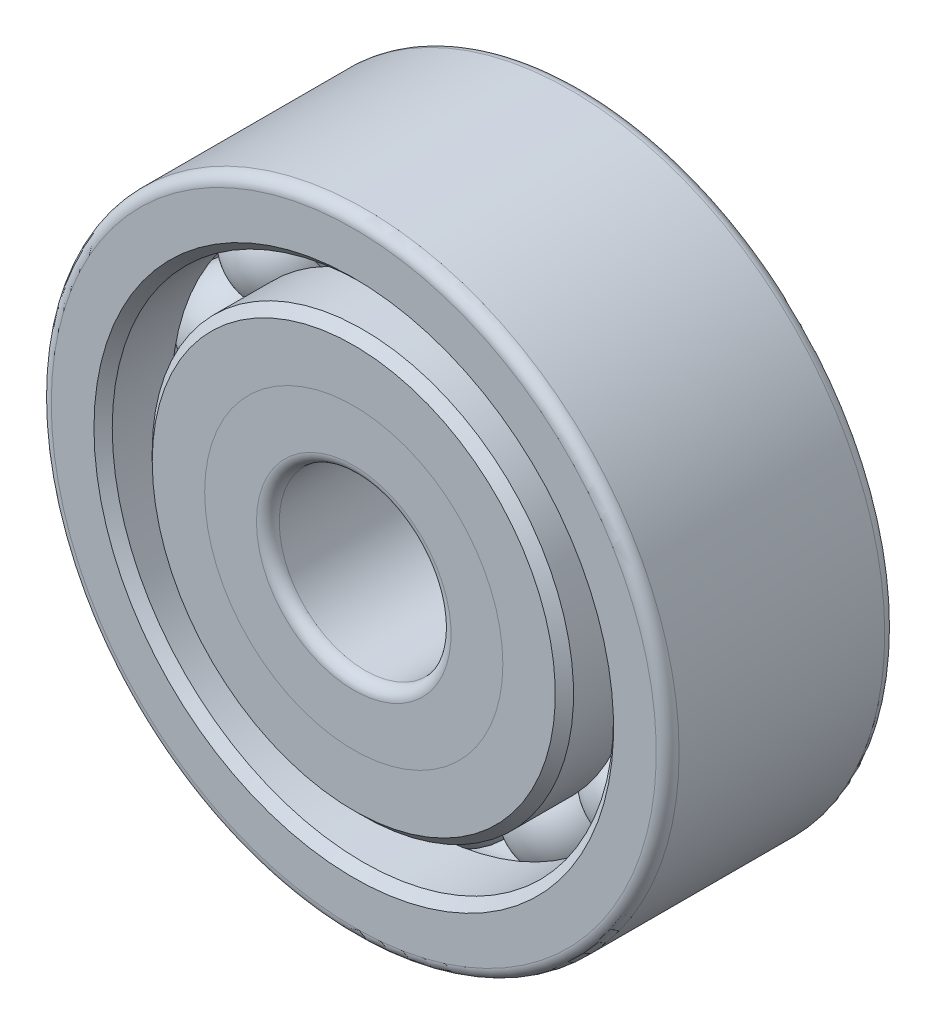
ISO-10303-21;
HEADER;
FILE_DESCRIPTION(('STEP AP214'),'2;1');
FILE_NAME('part.step','',(''),(''),'','','');
FILE_SCHEMA(('AUTOMOTIVE_DESIGN { 1 0 10303 214 1 1 1 1 }'));
ENDSEC;
DATA;
#1=APPLICATION_CONTEXT('core data for automotive mechanical design processes');
#2=APPLICATION_PROTOCOL_DEFINITION('international standard','automotive_design',2000,#1);
#3=PRODUCT_CONTEXT('',#1,'mechanical');
#4=PRODUCT('Part','Part','',(#3));
#5=PRODUCT_RELATED_PRODUCT_CATEGORY('part','',(#4));
#6=PRODUCT_DEFINITION_FORMATION('','',#4);
#7=PRODUCT_DEFINITION_CONTEXT('part definition',#1,'design');
#8=PRODUCT_DEFINITION('design','',#6,#7);
#9=PRODUCT_DEFINITION_SHAPE('','',#8);
#10=(LENGTH_UNIT() NAMED_UNIT(*) SI_UNIT(.MILLI.,.METRE.));
#11=(NAMED_UNIT(*) PLANE_ANGLE_UNIT() SI_UNIT($,.RADIAN.));
#12=(NAMED_UNIT(*) SI_UNIT($,.STERADIAN.) SOLID_ANGLE_UNIT());
#13=UNCERTAINTY_MEASURE_WITH_UNIT(LENGTH_MEASURE(1.E-05),#10,'distance_accuracy_value','');
#14=(GEOMETRIC_REPRESENTATION_CONTEXT(3) GLOBAL_UNCERTAINTY_ASSIGNED_CONTEXT((#13)) GLOBAL_UNIT_ASSIGNED_CONTEXT((#10,
#11,#12)) REPRESENTATION_CONTEXT('',''));
#15=CARTESIAN_POINT('',(0.,0.,0.));
#16=DIRECTION('',(0.,0.,1.));
#17=DIRECTION('',(1.,0.,0.));
#18=AXIS2_PLACEMENT_3D('',#15,#16,#17);
#19=CARTESIAN_POINT('',(0.,0.,-3.185));
#20=DIRECTION('',(0.,0.,1.));
#21=DIRECTION('',(1.,0.,0.));
#22=AXIS2_PLACEMENT_3D('',#19,#20,#21);
#23=CYLINDRICAL_SURFACE('',#22,4.14358666666667);
#24=CARTESIAN_POINT('',(0.,0.,-3.175));
#25=DIRECTION('',(0.,0.,1.));
#26=DIRECTION('',(1.,0.,0.));
#27=AXIS2_PLACEMENT_3D('',#24,#25,#26);
#28=CIRCLE('',#27,4.14358666666667);
#29=CARTESIAN_POINT('',(4.14358666666667,0.,-3.175));
#30=VERTEX_POINT('',#29);
#31=EDGE_CURVE('E60',#30,#30,#28,.T.);
#32=ORIENTED_EDGE('',*,*,#31,.T.);
#33=EDGE_LOOP('',(#32));
#34=FACE_BOUND('',#33,.T.);
#35=CARTESIAN_POINT('',(0.,0.,3.175));
#36=DIRECTION('',(0.,0.,-1.));
#37=DIRECTION('',(-1.,0.,0.));
#38=AXIS2_PLACEMENT_3D('',#35,#36,#37);
#39=CIRCLE('',#38,4.14358666666667);
#40=CARTESIAN_POINT('',(-4.14358666666667,0.,3.175));
#41=VERTEX_POINT('',#40);
#42=EDGE_CURVE('E48',#41,#41,#39,.T.);
#43=ORIENTED_EDGE('',*,*,#42,.T.);
#44=EDGE_LOOP('',(#43));
#45=FACE_BOUND('',#44,.T.);
#46=ADVANCED_FACE('F44',(#34,#45),#23,.T.);
#47=CARTESIAN_POINT('',(0.,2.3876,-3.175));
#48=DIRECTION('',(0.,0.,1.));
#49=DIRECTION('',(1.,0.,0.));
#50=AXIS2_PLACEMENT_3D('',#47,#48,#49);
#51=PLANE('',#50);
#52=CARTESIAN_POINT('',(0.,0.,-3.175));
#53=DIRECTION('',(0.,0.,1.));
#54=DIRECTION('',(1.,0.,0.));
#55=AXIS2_PLACEMENT_3D('',#52,#53,#54);
#56=CIRCLE('',#55,2.7051);
#57=CARTESIAN_POINT('',(2.7051,0.,-3.175));
#58=VERTEX_POINT('',#57);
#59=EDGE_CURVE('E11',#58,#58,#56,.T.);
#60=ORIENTED_EDGE('',*,*,#59,.T.);
#61=EDGE_LOOP('',(#60));
#62=FACE_BOUND('',#61,.T.);
#63=ORIENTED_EDGE('',*,*,#31,.F.);
#64=EDGE_LOOP('',(#63));
#65=FACE_BOUND('',#64,.T.);
#66=ADVANCED_FACE('F46',(#62,#65),#51,.F.);
#67=CARTESIAN_POINT('',(0.,5.855208,3.175));
#68=DIRECTION('',(0.,0.,-1.));
#69=DIRECTION('',(-1.,0.,0.));
#70=AXIS2_PLACEMENT_3D('',#67,#68,#69);
#71=PLANE('',#70);
#72=CARTESIAN_POINT('',(0.,0.,3.175));
#73=DIRECTION('',(0.,0.,-1.));
#74=DIRECTION('',(-1.,0.,0.));
#75=AXIS2_PLACEMENT_3D('',#72,#73,#74);
#76=CIRCLE('',#75,2.7051);
#77=CARTESIAN_POINT('',(-2.7051,0.,3.175));
#78=VERTEX_POINT('',#77);
#79=EDGE_CURVE('E62',#78,#78,#76,.T.);
#80=ORIENTED_EDGE('',*,*,#79,.T.);
#81=EDGE_LOOP('',(#80));
#82=FACE_BOUND('',#81,.T.);
#83=ORIENTED_EDGE('',*,*,#42,.F.);
#84=EDGE_LOOP('',(#83));
#85=FACE_BOUND('',#84,.T.);
#86=ADVANCED_FACE('F71',(#82,#85),#71,.F.);
#87=CARTESIAN_POINT('',(0.,0.,3.175));
#88=DIRECTION('',(0.,0.,1.));
#89=DIRECTION('',(1.,0.,0.));
#90=AXIS2_PLACEMENT_3D('',#87,#88,#89);
#91=CYLINDRICAL_SURFACE('',#90,2.3876);
#92=CARTESIAN_POINT('',(0.,0.,-2.8575));
#93=DIRECTION('',(0.,0.,1.));
#94=DIRECTION('',(1.,0.,0.));
#95=AXIS2_PLACEMENT_3D('',#92,#93,#94);
#96=CIRCLE('',#95,2.3876);
#97=CARTESIAN_POINT('',(2.3876,0.,-2.8575));
#98=VERTEX_POINT('',#97);
#99=EDGE_CURVE('E57',#98,#98,#96,.F.);
#100=ORIENTED_EDGE('',*,*,#99,.T.);
#101=EDGE_LOOP('',(#100));
#102=FACE_BOUND('',#101,.T.);
#103=CARTESIAN_POINT('',(0.,0.,2.8575));
#104=DIRECTION('',(0.,0.,-1.));
#105=DIRECTION('',(-1.,0.,0.));
#106=AXIS2_PLACEMENT_3D('',#103,#104,#105);
#107=CIRCLE('',#106,2.3876);
#108=CARTESIAN_POINT('',(-2.3876,0.,2.8575));
#109=VERTEX_POINT('',#108);
#110=EDGE_CURVE('E52',#109,#109,#107,.F.);
#111=ORIENTED_EDGE('',*,*,#110,.T.);
#112=EDGE_LOOP('',(#111));
#113=FACE_BOUND('',#112,.T.);
#114=ADVANCED_FACE('F73',(#102,#113),#91,.F.);
#115=CARTESIAN_POINT('',(0.,0.,-2.8575));
#116=DIRECTION('',(0.,0.,1.));
#117=DIRECTION('',(1.,0.,0.));
#118=AXIS2_PLACEMENT_3D('',#115,#116,#117);
#119=TOROIDAL_SURFACE('',#118,2.7051,0.3175);
#120=ORIENTED_EDGE('',*,*,#99,.F.);
#121=EDGE_LOOP('',(#120));
#122=FACE_BOUND('',#121,.T.);
#123=ORIENTED_EDGE('',*,*,#59,.F.);
#124=EDGE_LOOP('',(#123));
#125=FACE_BOUND('',#124,.T.);
#126=ADVANCED_FACE('F79',(#122,#125),#119,.T.);
#127=CARTESIAN_POINT('',(0.,0.,2.8575));
#128=DIRECTION('',(0.,0.,-1.));
#129=DIRECTION('',(-1.,0.,0.));
#130=AXIS2_PLACEMENT_3D('',#127,#128,#129);
#131=TOROIDAL_SURFACE('',#130,2.7051,0.3175);
#132=ORIENTED_EDGE('',*,*,#79,.F.);
#133=EDGE_LOOP('',(#132));
#134=FACE_BOUND('',#133,.T.);
#135=ORIENTED_EDGE('',*,*,#110,.F.);
#136=EDGE_LOOP('',(#135));
#137=FACE_BOUND('',#136,.T.);
#138=ADVANCED_FACE('F84',(#134,#137),#131,.T.);
#139=CLOSED_SHELL('',(#46,#66,#86,#114,#126,#138));
#140=MANIFOLD_SOLID_BREP('B2',#139);
#141=CARTESIAN_POINT('',(0.,0.,-3.185));
#142=DIRECTION('',(0.,0.,1.));
#143=DIRECTION('',(1.,0.,0.));
#144=AXIS2_PLACEMENT_3D('',#141,#142,#143);
#145=CYLINDRICAL_SURFACE('',#144,4.14358666666667);
#146=CARTESIAN_POINT('',(0.,0.,3.175));
#147=DIRECTION('',(0.,0.,-1.));
#148=DIRECTION('',(-1.,0.,0.));
#149=AXIS2_PLACEMENT_3D('',#146,#147,#148);
#150=CIRCLE('',#149,4.14358666666667);
#151=CARTESIAN_POINT('',(-4.14358666666667,0.,3.175));
#152=VERTEX_POINT('',#151);
#153=EDGE_CURVE('E148',#152,#152,#150,.T.);
#154=ORIENTED_EDGE('',*,*,#153,.F.);
#155=EDGE_LOOP('',(#154));
#156=FACE_BOUND('',#155,.T.);
#157=CARTESIAN_POINT('',(0.,0.,-3.175));
#158=DIRECTION('',(0.,0.,1.));
#159=DIRECTION('',(1.,0.,0.));
#160=AXIS2_PLACEMENT_3D('',#157,#158,#159);
#161=CIRCLE('',#160,4.14358666666667);
#162=CARTESIAN_POINT('',(4.14358666666667,0.,-3.175));
#163=VERTEX_POINT('',#162);
#164=EDGE_CURVE('E43',#163,#163,#161,.T.);
#165=ORIENTED_EDGE('',*,*,#164,.F.);
#166=EDGE_LOOP('',(#165));
#167=FACE_BOUND('',#166,.T.);
#168=ADVANCED_FACE('F142',(#156,#167),#145,.F.);
#169=CARTESIAN_POINT('',(0.,0.,0.));
#170=DIRECTION('',(0.,0.,1.));
#171=DIRECTION('',(1.,0.,0.));
#172=AXIS2_PLACEMENT_3D('',#169,#170,#171);
#173=TOROIDAL_SURFACE('',#172,6.41096,1.38938);
#174=CARTESIAN_POINT('',(0.,0.,-1.27338780381155));
#175=DIRECTION('',(0.,0.,1.));
#176=DIRECTION('',(1.,0.,0.));
#177=AXIS2_PLACEMENT_3D('',#174,#175,#176);
#178=CIRCLE('',#177,5.855208);
#179=CARTESIAN_POINT('',(5.855208,0.,-1.27338780381155));
#180=VERTEX_POINT('',#179);
#181=EDGE_CURVE('E170',#180,#180,#178,.T.);
#182=ORIENTED_EDGE('',*,*,#181,.T.);
#183=EDGE_LOOP('',(#182));
#184=FACE_BOUND('',#183,.T.);
#185=CARTESIAN_POINT('',(0.,0.,1.27338780381155));
#186=DIRECTION('',(0.,0.,-1.));
#187=DIRECTION('',(-1.,0.,0.));
#188=AXIS2_PLACEMENT_3D('',#185,#186,#187);
#189=CIRCLE('',#188,5.855208);
#190=CARTESIAN_POINT('',(-5.855208,0.,1.27338780381155));
#191=VERTEX_POINT('',#190);
#192=EDGE_CURVE('E167',#191,#191,#189,.T.);
#193=ORIENTED_EDGE('',*,*,#192,.T.);
#194=EDGE_LOOP('',(#193));
#195=FACE_BOUND('',#194,.T.);
#196=ADVANCED_FACE('F174',(#184,#195),#173,.F.);
#197=CARTESIAN_POINT('',(0.,0.,3.175));
#198=DIRECTION('',(0.,0.,1.));
#199=DIRECTION('',(1.,0.,0.));
#200=AXIS2_PLACEMENT_3D('',#197,#198,#199);
#201=CYLINDRICAL_SURFACE('',#200,5.855208);
#202=CARTESIAN_POINT('',(0.,0.,2.921));
#203=DIRECTION('',(0.,0.,-1.));
#204=DIRECTION('',(-1.,0.,0.));
#205=AXIS2_PLACEMENT_3D('',#202,#203,#204);
#206=CIRCLE('',#205,5.855208);
#207=CARTESIAN_POINT('',(-5.855208,0.,2.921));
#208=VERTEX_POINT('',#207);
#209=EDGE_CURVE('E152',#208,#208,#206,.T.);
#210=ORIENTED_EDGE('',*,*,#209,.T.);
#211=EDGE_LOOP('',(#210));
#212=FACE_BOUND('',#211,.T.);
#213=ORIENTED_EDGE('',*,*,#192,.F.);
#214=EDGE_LOOP('',(#213));
#215=FACE_BOUND('',#214,.T.);
#216=ADVANCED_FACE('F183',(#212,#215),#201,.T.);
#217=CARTESIAN_POINT('',(0.,0.,3.175));
#218=DIRECTION('',(0.,0.,-1.));
#219=DIRECTION('',(-1.,0.,0.));
#220=AXIS2_PLACEMENT_3D('',#217,#218,#219);
#221=CONICAL_SURFACE('',#220,5.601208,0.785398163397442);
#222=ORIENTED_EDGE('',*,*,#209,.F.);
#223=EDGE_LOOP('',(#222));
#224=FACE_BOUND('',#223,.T.);
#225=CARTESIAN_POINT('',(0.,0.,3.175));
#226=DIRECTION('',(0.,0.,-1.));
#227=DIRECTION('',(-1.,0.,0.));
#228=AXIS2_PLACEMENT_3D('',#225,#226,#227);
#229=CIRCLE('',#228,5.601208);
#230=CARTESIAN_POINT('',(-5.601208,0.,3.175));
#231=VERTEX_POINT('',#230);
#232=EDGE_CURVE('E156',#231,#231,#229,.F.);
#233=ORIENTED_EDGE('',*,*,#232,.F.);
#234=EDGE_LOOP('',(#233));
#235=FACE_BOUND('',#234,.T.);
#236=ADVANCED_FACE('F191',(#224,#235),#221,.T.);
#237=CARTESIAN_POINT('',(0.,5.855208,3.175));
#238=DIRECTION('',(0.,0.,-1.));
#239=DIRECTION('',(-1.,0.,0.));
#240=AXIS2_PLACEMENT_3D('',#237,#238,#239);
#241=PLANE('',#240);
#242=ORIENTED_EDGE('',*,*,#153,.T.);
#243=EDGE_LOOP('',(#242));
#244=FACE_BOUND('',#243,.T.);
#245=ORIENTED_EDGE('',*,*,#232,.T.);
#246=EDGE_LOOP('',(#245));
#247=FACE_BOUND('',#246,.T.);
#248=ADVANCED_FACE('F180',(#244,#247),#241,.F.);
#249=CARTESIAN_POINT('',(0.,0.,-2.921));
#250=DIRECTION('',(0.,0.,1.));
#251=DIRECTION('',(1.,0.,0.));
#252=AXIS2_PLACEMENT_3D('',#249,#250,#251);
#253=CIRCLE('',#252,5.855208);
#254=CARTESIAN_POINT('',(5.855208,0.,-2.921));
#255=VERTEX_POINT('',#254);
#256=EDGE_CURVE('E164',#255,#255,#253,.T.);
#257=ORIENTED_EDGE('',*,*,#256,.T.);
#258=EDGE_LOOP('',(#257));
#259=FACE_BOUND('',#258,.T.);
#260=ORIENTED_EDGE('',*,*,#181,.F.);
#261=EDGE_LOOP('',(#260));
#262=FACE_BOUND('',#261,.T.);
#263=ADVANCED_FACE('F177',(#259,#262),#201,.T.);
#264=CARTESIAN_POINT('',(0.,0.,-2.921));
#265=DIRECTION('',(0.,0.,1.));
#266=DIRECTION('',(1.,0.,0.));
#267=AXIS2_PLACEMENT_3D('',#264,#265,#266);
#268=CONICAL_SURFACE('',#267,5.855208,0.785398163397453);
#269=CARTESIAN_POINT('',(0.,0.,-3.175));
#270=DIRECTION('',(0.,0.,1.));
#271=DIRECTION('',(1.,0.,0.));
#272=AXIS2_PLACEMENT_3D('',#269,#270,#271);
#273=CIRCLE('',#272,5.601208);
#274=CARTESIAN_POINT('',(5.601208,0.,-3.175));
#275=VERTEX_POINT('',#274);
#276=EDGE_CURVE('E161',#275,#275,#273,.F.);
#277=ORIENTED_EDGE('',*,*,#276,.F.);
#278=EDGE_LOOP('',(#277));
#279=FACE_BOUND('',#278,.T.);
#280=ORIENTED_EDGE('',*,*,#256,.F.);
#281=EDGE_LOOP('',(#280));
#282=FACE_BOUND('',#281,.T.);
#283=ADVANCED_FACE('F179',(#279,#282),#268,.T.);
#284=CARTESIAN_POINT('',(0.,2.3876,-3.175));
#285=DIRECTION('',(0.,0.,1.));
#286=DIRECTION('',(1.,0.,0.));
#287=AXIS2_PLACEMENT_3D('',#284,#285,#286);
#288=PLANE('',#287);
#289=ORIENTED_EDGE('',*,*,#164,.T.);
#290=EDGE_LOOP('',(#289));
#291=FACE_BOUND('',#290,.T.);
#292=ORIENTED_EDGE('',*,*,#276,.T.);
#293=EDGE_LOOP('',(#292));
#294=FACE_BOUND('',#293,.T.);
#295=ADVANCED_FACE('F188',(#291,#294),#288,.F.);
#296=CLOSED_SHELL('',(#168,#196,#216,#236,#248,#263,#283,#295));
#297=MANIFOLD_SOLID_BREP('B6',#296);
#298=CARTESIAN_POINT('',(-2.78161129613302,5.77607537336773,0.));
#299=DIRECTION('',(0.,0.,1.));
#300=DIRECTION('',(-0.433883739117546,0.900968867902425,0.));
#301=AXIS2_PLACEMENT_3D('',#298,#299,#300);
#302=SPHERICAL_SURFACE('',#301,1.38938);
#303=CARTESIAN_POINT('',(-2.78161129613302,5.77607537336773,1.38938));
#304=VERTEX_POINT('',#303);
#305=VERTEX_LOOP('',#304);
#306=FACE_BOUND('',#305,.T.);
#307=ADVANCED_FACE('F269',(#306),#302,.T.);
#308=CLOSED_SHELL('',(#307));
#309=MANIFOLD_SOLID_BREP('B38',#308);
#310=CARTESIAN_POINT('',(-5.01229036084319,3.99716818012433,0.));
#311=DIRECTION('',(0.,0.,1.));
#312=DIRECTION('',(-0.781831482468022,0.623489801858743,0.));
#313=AXIS2_PLACEMENT_3D('',#310,#311,#312);
#314=SPHERICAL_SURFACE('',#313,1.38938);
#315=CARTESIAN_POINT('',(-5.01229036084319,3.99716818012433,1.38938));
#316=VERTEX_POINT('',#315);
#317=VERTEX_LOOP('',#316);
#318=FACE_BOUND('',#317,.T.);
#319=ADVANCED_FACE('F290',(#318),#314,.T.);
#320=CLOSED_SHELL('',(#319));
#321=MANIFOLD_SOLID_BREP('B138',#320);
#322=CARTESIAN_POINT('',(-6.25022384788117,1.42657280675664,0.));
#323=DIRECTION('',(0.,0.,1.));
#324=DIRECTION('',(-0.974927912181821,0.222520933956325,0.));
#325=AXIS2_PLACEMENT_3D('',#322,#323,#324);
#326=SPHERICAL_SURFACE('',#325,1.38938);
#327=CARTESIAN_POINT('',(-6.25022384788117,1.42657280675664,1.38938));
#328=VERTEX_POINT('',#327);
#329=VERTEX_LOOP('',#328);
#330=FACE_BOUND('',#329,.T.);
#331=ADVANCED_FACE('F311',(#330),#326,.T.);
#332=CLOSED_SHELL('',(#331));
#333=MANIFOLD_SOLID_BREP('B265',#332);
#334=CARTESIAN_POINT('',(-6.2502238478812,-1.42657280675651,0.));
#335=DIRECTION('',(0.,0.,1.));
#336=DIRECTION('',(-0.974927912181826,-0.222520933956305,0.));
#337=AXIS2_PLACEMENT_3D('',#334,#335,#336);
#338=SPHERICAL_SURFACE('',#337,1.38938);
#339=CARTESIAN_POINT('',(-6.2502238478812,-1.42657280675651,1.38938));
#340=VERTEX_POINT('',#339);
#341=VERTEX_LOOP('',#340);
#342=FACE_BOUND('',#341,.T.);
#343=ADVANCED_FACE('F332',(#342),#338,.T.);
#344=CLOSED_SHELL('',(#343));
#345=MANIFOLD_SOLID_BREP('B286',#344);
#346=CARTESIAN_POINT('',(-5.01229036084328,-3.99716818012422,0.));
#347=DIRECTION('',(0.,0.,1.));
#348=DIRECTION('',(-0.781831482468035,-0.623489801858727,0.));
#349=AXIS2_PLACEMENT_3D('',#346,#347,#348);
#350=SPHERICAL_SURFACE('',#349,1.38938);
#351=CARTESIAN_POINT('',(-5.01229036084328,-3.99716818012422,1.38938));
#352=VERTEX_POINT('',#351);
#353=VERTEX_LOOP('',#352);
#354=FACE_BOUND('',#353,.T.);
#355=ADVANCED_FACE('F353',(#354),#350,.T.);
#356=CLOSED_SHELL('',(#355));
#357=MANIFOLD_SOLID_BREP('B307',#356);
#358=CARTESIAN_POINT('',(-2.78161129613315,-5.77607537336767,0.));
#359=DIRECTION('',(0.,0.,1.));
#360=DIRECTION('',(-0.433883739117565,-0.900968867902416,0.));
#361=AXIS2_PLACEMENT_3D('',#358,#359,#360);
#362=SPHERICAL_SURFACE('',#361,1.38938);
#363=CARTESIAN_POINT('',(-2.78161129613315,-5.77607537336767,1.38938));
#364=VERTEX_POINT('',#363);
#365=VERTEX_LOOP('',#364);
#366=FACE_BOUND('',#365,.T.);
#367=ADVANCED_FACE('F374',(#366),#362,.T.);
#368=CLOSED_SHELL('',(#367));
#369=MANIFOLD_SOLID_BREP('B328',#368);
#370=CARTESIAN_POINT('',(0.,-6.41096,0.));
#371=DIRECTION('',(0.,0.,1.));
#372=DIRECTION('',(0.,-1.,0.));
#373=AXIS2_PLACEMENT_3D('',#370,#371,#372);
#374=SPHERICAL_SURFACE('',#373,1.38938);
#375=CARTESIAN_POINT('',(0.,-6.41096,1.38938));
#376=VERTEX_POINT('',#375);
#377=VERTEX_LOOP('',#376);
#378=FACE_BOUND('',#377,.T.);
#379=ADVANCED_FACE('F395',(#378),#374,.T.);
#380=CLOSED_SHELL('',(#379));
#381=MANIFOLD_SOLID_BREP('B349',#380);
#382=CARTESIAN_POINT('',(2.78161129613307,-5.77607537336771,0.));
#383=DIRECTION('',(0.,0.,1.));
#384=DIRECTION('',(0.433883739117553,-0.900968867902422,0.));
#385=AXIS2_PLACEMENT_3D('',#382,#383,#384);
#386=SPHERICAL_SURFACE('',#385,1.38938);
#387=CARTESIAN_POINT('',(2.78161129613307,-5.77607537336771,1.38938));
#388=VERTEX_POINT('',#387);
#389=VERTEX_LOOP('',#388);
#390=FACE_BOUND('',#389,.T.);
#391=ADVANCED_FACE('F416',(#390),#386,.T.);
#392=CLOSED_SHELL('',(#391));
#393=MANIFOLD_SOLID_BREP('B370',#392);
#394=CARTESIAN_POINT('',(5.01229036084322,-3.99716818012429,0.));
#395=DIRECTION('',(0.,0.,1.));
#396=DIRECTION('',(0.781831482468027,-0.623489801858737,0.));
#397=AXIS2_PLACEMENT_3D('',#394,#395,#396);
#398=SPHERICAL_SURFACE('',#397,1.38938);
#399=CARTESIAN_POINT('',(5.01229036084322,-3.99716818012429,1.38938));
#400=VERTEX_POINT('',#399);
#401=VERTEX_LOOP('',#400);
#402=FACE_BOUND('',#401,.T.);
#403=ADVANCED_FACE('F437',(#402),#398,.T.);
#404=CLOSED_SHELL('',(#403));
#405=MANIFOLD_SOLID_BREP('B391',#404);
#406=CARTESIAN_POINT('',(6.25022384788118,-1.4265728067566,0.));
#407=DIRECTION('',(0.,0.,1.));
#408=DIRECTION('',(0.974927912181823,-0.222520933956318,0.));
#409=AXIS2_PLACEMENT_3D('',#406,#407,#408);
#410=SPHERICAL_SURFACE('',#409,1.38938);
#411=CARTESIAN_POINT('',(6.25022384788118,-1.4265728067566,1.38938));
#412=VERTEX_POINT('',#411);
#413=VERTEX_LOOP('',#412);
#414=FACE_BOUND('',#413,.T.);
#415=ADVANCED_FACE('F458',(#414),#410,.T.);
#416=CLOSED_SHELL('',(#415));
#417=MANIFOLD_SOLID_BREP('B412',#416);
#418=CARTESIAN_POINT('',(6.25022384788119,1.42657280675655,0.));
#419=DIRECTION('',(0.,0.,1.));
#420=DIRECTION('',(0.974927912181824,0.222520933956311,0.));
#421=AXIS2_PLACEMENT_3D('',#418,#419,#420);
#422=SPHERICAL_SURFACE('',#421,1.38938);
#423=CARTESIAN_POINT('',(6.25022384788119,1.42657280675655,1.38938));
#424=VERTEX_POINT('',#423);
#425=VERTEX_LOOP('',#424);
#426=FACE_BOUND('',#425,.T.);
#427=ADVANCED_FACE('F479',(#426),#422,.T.);
#428=CLOSED_SHELL('',(#427));
#429=MANIFOLD_SOLID_BREP('B433',#428);
#430=CARTESIAN_POINT('',(5.01229036084325,3.99716818012426,0.));
#431=DIRECTION('',(0.,0.,1.));
#432=DIRECTION('',(0.781831482468031,0.623489801858732,0.));
#433=AXIS2_PLACEMENT_3D('',#430,#431,#432);
#434=SPHERICAL_SURFACE('',#433,1.38938);
#435=CARTESIAN_POINT('',(5.01229036084325,3.99716818012426,1.38938));
#436=VERTEX_POINT('',#435);
#437=VERTEX_LOOP('',#436);
#438=FACE_BOUND('',#437,.T.);
#439=ADVANCED_FACE('F500',(#438),#434,.T.);
#440=CLOSED_SHELL('',(#439));
#441=MANIFOLD_SOLID_BREP('B454',#440);
#442=CARTESIAN_POINT('',(2.78161129613311,5.77607537336769,0.));
#443=DIRECTION('',(0.,0.,1.));
#444=DIRECTION('',(0.433883739117559,0.900968867902419,0.));
#445=AXIS2_PLACEMENT_3D('',#442,#443,#444);
#446=SPHERICAL_SURFACE('',#445,1.38938);
#447=CARTESIAN_POINT('',(2.78161129613311,5.77607537336769,1.38938));
#448=VERTEX_POINT('',#447);
#449=VERTEX_LOOP('',#448);
#450=FACE_BOUND('',#449,.T.);
#451=ADVANCED_FACE('F521',(#450),#446,.T.);
#452=CLOSED_SHELL('',(#451));
#453=MANIFOLD_SOLID_BREP('B475',#452);
#454=CARTESIAN_POINT('',(0.,6.41096,0.));
#455=DIRECTION('',(0.,0.,1.));
#456=DIRECTION('',(0.,1.,0.));
#457=AXIS2_PLACEMENT_3D('',#454,#455,#456);
#458=SPHERICAL_SURFACE('',#457,1.38938);
#459=CARTESIAN_POINT('',(0.,6.41096,1.38938));
#460=VERTEX_POINT('',#459);
#461=VERTEX_LOOP('',#460);
#462=FACE_BOUND('',#461,.T.);
#463=ADVANCED_FACE('F543',(#462),#458,.T.);
#464=CLOSED_SHELL('',(#463));
#465=MANIFOLD_SOLID_BREP('B496',#464);
#466=CARTESIAN_POINT('',(0.,0.,3.175));
#467=DIRECTION('',(0.,0.,1.));
#468=DIRECTION('',(1.,0.,0.));
#469=AXIS2_PLACEMENT_3D('',#466,#467,#468);
#470=CYLINDRICAL_SURFACE('',#469,6.966712);
#471=CARTESIAN_POINT('',(0.,0.,2.921));
#472=DIRECTION('',(0.,0.,-1.));
#473=DIRECTION('',(-1.,0.,0.));
#474=AXIS2_PLACEMENT_3D('',#471,#472,#473);
#475=CIRCLE('',#474,6.966712);
#476=CARTESIAN_POINT('',(-6.966712,0.,2.921));
#477=VERTEX_POINT('',#476);
#478=EDGE_CURVE('E563',#477,#477,#475,.F.);
#479=ORIENTED_EDGE('',*,*,#478,.T.);
#480=EDGE_LOOP('',(#479));
#481=FACE_BOUND('',#480,.T.);
#482=CARTESIAN_POINT('',(0.,0.,1.27338780381155));
#483=DIRECTION('',(0.,0.,-1.));
#484=DIRECTION('',(-1.,0.,0.));
#485=AXIS2_PLACEMENT_3D('',#482,#483,#484);
#486=CIRCLE('',#485,6.966712);
#487=CARTESIAN_POINT('',(-6.966712,0.,1.27338780381155));
#488=VERTEX_POINT('',#487);
#489=EDGE_CURVE('E588',#488,#488,#486,.F.);
#490=ORIENTED_EDGE('',*,*,#489,.F.);
#491=EDGE_LOOP('',(#490));
#492=FACE_BOUND('',#491,.T.);
#493=ADVANCED_FACE('F556',(#481,#492),#470,.F.);
#494=CARTESIAN_POINT('',(0.,0.,-2.92100000000001));
#495=DIRECTION('',(0.,0.,1.));
#496=DIRECTION('',(1.,0.,0.));
#497=AXIS2_PLACEMENT_3D('',#494,#495,#496);
#498=CIRCLE('',#497,6.966712);
#499=CARTESIAN_POINT('',(6.966712,0.,-2.92100000000001));
#500=VERTEX_POINT('',#499);
#501=EDGE_CURVE('E567',#500,#500,#498,.F.);
#502=ORIENTED_EDGE('',*,*,#501,.T.);
#503=EDGE_LOOP('',(#502));
#504=FACE_BOUND('',#503,.T.);
#505=CARTESIAN_POINT('',(0.,0.,-1.27338780381155));
#506=DIRECTION('',(0.,0.,1.));
#507=DIRECTION('',(1.,0.,0.));
#508=AXIS2_PLACEMENT_3D('',#505,#506,#507);
#509=CIRCLE('',#508,6.966712);
#510=CARTESIAN_POINT('',(6.966712,0.,-1.27338780381155));
#511=VERTEX_POINT('',#510);
#512=EDGE_CURVE('E591',#511,#511,#509,.F.);
#513=ORIENTED_EDGE('',*,*,#512,.F.);
#514=EDGE_LOOP('',(#513));
#515=FACE_BOUND('',#514,.T.);
#516=ADVANCED_FACE('F598',(#504,#515),#470,.F.);
#517=CARTESIAN_POINT('',(0.,0.,3.175));
#518=DIRECTION('',(0.,0.,1.));
#519=DIRECTION('',(1.,0.,0.));
#520=AXIS2_PLACEMENT_3D('',#517,#518,#519);
#521=CYLINDRICAL_SURFACE('',#520,8.7249);
#522=CARTESIAN_POINT('',(0.,0.,-2.8575));
#523=DIRECTION('',(0.,0.,1.));
#524=DIRECTION('',(1.,0.,0.));
#525=AXIS2_PLACEMENT_3D('',#522,#523,#524);
#526=CIRCLE('',#525,8.7249);
#527=CARTESIAN_POINT('',(8.7249,0.,-2.8575));
#528=VERTEX_POINT('',#527);
#529=EDGE_CURVE('E582',#528,#528,#526,.T.);
#530=ORIENTED_EDGE('',*,*,#529,.T.);
#531=EDGE_LOOP('',(#530));
#532=FACE_BOUND('',#531,.T.);
#533=CARTESIAN_POINT('',(0.,0.,2.8575));
#534=DIRECTION('',(0.,0.,-1.));
#535=DIRECTION('',(-1.,0.,0.));
#536=AXIS2_PLACEMENT_3D('',#533,#534,#535);
#537=CIRCLE('',#536,8.7249);
#538=CARTESIAN_POINT('',(-8.7249,0.,2.8575));
#539=VERTEX_POINT('',#538);
#540=EDGE_CURVE('E585',#539,#539,#537,.T.);
#541=ORIENTED_EDGE('',*,*,#540,.T.);
#542=EDGE_LOOP('',(#541));
#543=FACE_BOUND('',#542,.T.);
#544=ADVANCED_FACE('F600',(#532,#543),#521,.T.);
#545=CARTESIAN_POINT('',(0.,8.7249,3.175));
#546=DIRECTION('',(0.,0.,-1.));
#547=DIRECTION('',(-1.,0.,0.));
#548=AXIS2_PLACEMENT_3D('',#545,#546,#547);
#549=PLANE('',#548);
#550=CARTESIAN_POINT('',(0.,0.,3.175));
#551=DIRECTION('',(0.,0.,-1.));
#552=DIRECTION('',(-1.,0.,0.));
#553=AXIS2_PLACEMENT_3D('',#550,#551,#552);
#554=CIRCLE('',#553,7.220712);
#555=CARTESIAN_POINT('',(-7.220712,0.,3.175));
#556=VERTEX_POINT('',#555);
#557=EDGE_CURVE('E542',#556,#556,#554,.T.);
#558=ORIENTED_EDGE('',*,*,#557,.T.);
#559=EDGE_LOOP('',(#558));
#560=FACE_BOUND('',#559,.T.);
#561=CARTESIAN_POINT('',(0.,0.,3.175));
#562=DIRECTION('',(0.,0.,-1.));
#563=DIRECTION('',(-1.,0.,0.));
#564=AXIS2_PLACEMENT_3D('',#561,#562,#563);
#565=CIRCLE('',#564,8.4074);
#566=CARTESIAN_POINT('',(-8.4074,0.,3.175));
#567=VERTEX_POINT('',#566);
#568=EDGE_CURVE('E576',#567,#567,#565,.F.);
#569=ORIENTED_EDGE('',*,*,#568,.T.);
#570=EDGE_LOOP('',(#569));
#571=FACE_BOUND('',#570,.T.);
#572=ADVANCED_FACE('F607',(#560,#571),#549,.F.);
#573=CARTESIAN_POINT('',(0.,6.966712,-3.175));
#574=DIRECTION('',(0.,0.,1.));
#575=DIRECTION('',(1.,0.,0.));
#576=AXIS2_PLACEMENT_3D('',#573,#574,#575);
#577=PLANE('',#576);
#578=CARTESIAN_POINT('',(0.,0.,-3.175));
#579=DIRECTION('',(0.,0.,1.));
#580=DIRECTION('',(1.,0.,0.));
#581=AXIS2_PLACEMENT_3D('',#578,#579,#580);
#582=CIRCLE('',#581,7.220712);
#583=CARTESIAN_POINT('',(7.220712,0.,-3.175));
#584=VERTEX_POINT('',#583);
#585=EDGE_CURVE('E571',#584,#584,#582,.T.);
#586=ORIENTED_EDGE('',*,*,#585,.T.);
#587=EDGE_LOOP('',(#586));
#588=FACE_BOUND('',#587,.T.);
#589=CARTESIAN_POINT('',(0.,0.,-3.175));
#590=DIRECTION('',(0.,0.,1.));
#591=DIRECTION('',(1.,0.,0.));
#592=AXIS2_PLACEMENT_3D('',#589,#590,#591);
#593=CIRCLE('',#592,8.4074);
#594=CARTESIAN_POINT('',(8.4074,0.,-3.175));
#595=VERTEX_POINT('',#594);
#596=EDGE_CURVE('E579',#595,#595,#593,.F.);
#597=ORIENTED_EDGE('',*,*,#596,.T.);
#598=EDGE_LOOP('',(#597));
#599=FACE_BOUND('',#598,.T.);
#600=ADVANCED_FACE('F612',(#588,#599),#577,.F.);
#601=CARTESIAN_POINT('',(0.,0.,0.));
#602=DIRECTION('',(0.,0.,1.));
#603=DIRECTION('',(1.,0.,0.));
#604=AXIS2_PLACEMENT_3D('',#601,#602,#603);
#605=TOROIDAL_SURFACE('',#604,6.41096,1.38938);
#606=ORIENTED_EDGE('',*,*,#512,.T.);
#607=EDGE_LOOP('',(#606));
#608=FACE_BOUND('',#607,.T.);
#609=ORIENTED_EDGE('',*,*,#489,.T.);
#610=EDGE_LOOP('',(#609));
#611=FACE_BOUND('',#610,.T.);
#612=ADVANCED_FACE('F595',(#608,#611),#605,.F.);
#613=CARTESIAN_POINT('',(0.,0.,-2.8575));
#614=DIRECTION('',(0.,0.,1.));
#615=DIRECTION('',(1.,0.,0.));
#616=AXIS2_PLACEMENT_3D('',#613,#614,#615);
#617=TOROIDAL_SURFACE('',#616,8.4074,0.3175);
#618=ORIENTED_EDGE('',*,*,#596,.F.);
#619=EDGE_LOOP('',(#618));
#620=FACE_BOUND('',#619,.T.);
#621=ORIENTED_EDGE('',*,*,#529,.F.);
#622=EDGE_LOOP('',(#621));
#623=FACE_BOUND('',#622,.T.);
#624=ADVANCED_FACE('F616',(#620,#623),#617,.T.);
#625=CARTESIAN_POINT('',(0.,0.,2.8575));
#626=DIRECTION('',(0.,0.,-1.));
#627=DIRECTION('',(-1.,0.,0.));
#628=AXIS2_PLACEMENT_3D('',#625,#626,#627);
#629=TOROIDAL_SURFACE('',#628,8.4074,0.3175);
#630=ORIENTED_EDGE('',*,*,#540,.F.);
#631=EDGE_LOOP('',(#630));
#632=FACE_BOUND('',#631,.T.);
#633=ORIENTED_EDGE('',*,*,#568,.F.);
#634=EDGE_LOOP('',(#633));
#635=FACE_BOUND('',#634,.T.);
#636=ADVANCED_FACE('F619',(#632,#635),#629,.T.);
#637=CARTESIAN_POINT('',(0.,0.,-3.175));
#638=DIRECTION('',(0.,0.,-1.));
#639=DIRECTION('',(-1.,0.,0.));
#640=AXIS2_PLACEMENT_3D('',#637,#638,#639);
#641=CONICAL_SURFACE('',#640,7.220712,0.785398163397448);
#642=ORIENTED_EDGE('',*,*,#501,.F.);
#643=EDGE_LOOP('',(#642));
#644=FACE_BOUND('',#643,.T.);
#645=ORIENTED_EDGE('',*,*,#585,.F.);
#646=EDGE_LOOP('',(#645));
#647=FACE_BOUND('',#646,.T.);
#648=ADVANCED_FACE('F622',(#644,#647),#641,.F.);
#649=CARTESIAN_POINT('',(0.,0.,2.921));
#650=DIRECTION('',(0.,0.,1.));
#651=DIRECTION('',(1.,0.,0.));
#652=AXIS2_PLACEMENT_3D('',#649,#650,#651);
#653=CONICAL_SURFACE('',#652,6.966712,0.785398163397448);
#654=ORIENTED_EDGE('',*,*,#557,.F.);
#655=EDGE_LOOP('',(#654));
#656=FACE_BOUND('',#655,.T.);
#657=ORIENTED_EDGE('',*,*,#478,.F.);
#658=EDGE_LOOP('',(#657));
#659=FACE_BOUND('',#658,.T.);
#660=ADVANCED_FACE('F558',(#656,#659),#653,.F.);
#661=CLOSED_SHELL('',(#493,#516,#544,#572,#600,#612,#624,#636,#648,#660));
#662=MANIFOLD_SOLID_BREP('B517',#661);
#663=ADVANCED_BREP_SHAPE_REPRESENTATION('',(#18,#140,#297,#309,#321,#333,#345,#357,#369,#381,
#393,#405,#417,#429,#441,#453,#465,#662),#14);
#664=SHAPE_DEFINITION_REPRESENTATION(#9,#663);
ENDSEC;
END-ISO-10303-21;
